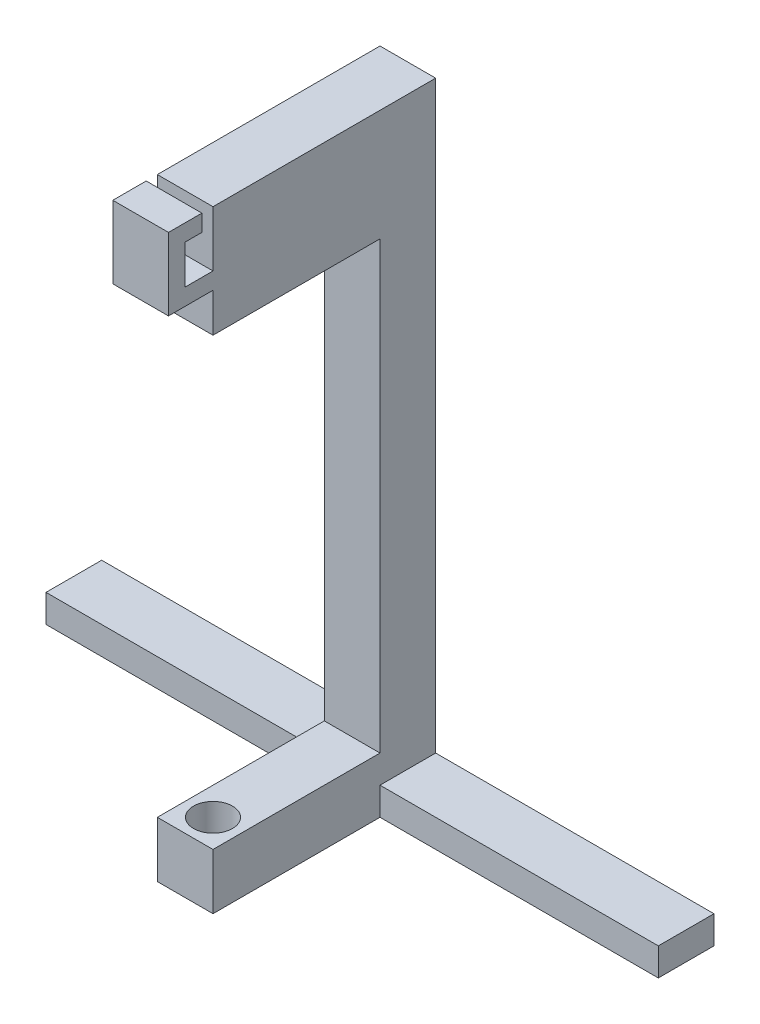
ISO-10303-21;
HEADER;
FILE_DESCRIPTION(('STEP AP214'),'2;1');
FILE_NAME('part.step','',(''),(''),'','','');
FILE_SCHEMA(('AUTOMOTIVE_DESIGN { 1 0 10303 214 1 1 1 1 }'));
ENDSEC;
DATA;
#1=APPLICATION_CONTEXT('core data for automotive mechanical design processes');
#2=APPLICATION_PROTOCOL_DEFINITION('international standard','automotive_design',2000,#1);
#3=PRODUCT_CONTEXT('',#1,'mechanical');
#4=PRODUCT('Part','Part','',(#3));
#5=PRODUCT_RELATED_PRODUCT_CATEGORY('part','',(#4));
#6=PRODUCT_DEFINITION_FORMATION('','',#4);
#7=PRODUCT_DEFINITION_CONTEXT('part definition',#1,'design');
#8=PRODUCT_DEFINITION('design','',#6,#7);
#9=PRODUCT_DEFINITION_SHAPE('','',#8);
#10=(LENGTH_UNIT() NAMED_UNIT(*) SI_UNIT(.MILLI.,.METRE.));
#11=(NAMED_UNIT(*) PLANE_ANGLE_UNIT() SI_UNIT($,.RADIAN.));
#12=(NAMED_UNIT(*) SI_UNIT($,.STERADIAN.) SOLID_ANGLE_UNIT());
#13=UNCERTAINTY_MEASURE_WITH_UNIT(LENGTH_MEASURE(1.E-05),#10,'distance_accuracy_value','');
#14=(GEOMETRIC_REPRESENTATION_CONTEXT(3) GLOBAL_UNCERTAINTY_ASSIGNED_CONTEXT((#13)) GLOBAL_UNIT_ASSIGNED_CONTEXT((#10,
#11,#12)) REPRESENTATION_CONTEXT('',''));
#15=CARTESIAN_POINT('',(0.,0.,0.));
#16=DIRECTION('',(0.,0.,1.));
#17=DIRECTION('',(1.,0.,0.));
#18=AXIS2_PLACEMENT_3D('',#15,#16,#17);
#19=CARTESIAN_POINT('',(0.,110.,15.));
#20=DIRECTION('',(0.,0.,1.));
#21=DIRECTION('',(1.,0.,0.));
#22=AXIS2_PLACEMENT_3D('',#19,#20,#21);
#23=PLANE('',#22);
#24=DIRECTION('',(-1.,0.,0.));
#25=VECTOR('',#24,1.);
#26=CARTESIAN_POINT('',(10.,107.,15.));
#27=LINE('',#26,#25);
#28=CARTESIAN_POINT('',(10.,107.,15.));
#29=VERTEX_POINT('',#28);
#30=CARTESIAN_POINT('',(0.,107.,15.));
#31=VERTEX_POINT('',#30);
#32=EDGE_CURVE('E201',#29,#31,#27,.T.);
#33=ORIENTED_EDGE('',*,*,#32,.F.);
#34=DIRECTION('',(0.,-1.,0.));
#35=VECTOR('',#34,1.);
#36=CARTESIAN_POINT('',(10.,110.,15.));
#37=LINE('',#36,#35);
#38=CARTESIAN_POINT('',(10.,100.,15.));
#39=VERTEX_POINT('',#38);
#40=EDGE_CURVE('E205',#29,#39,#37,.T.);
#41=ORIENTED_EDGE('',*,*,#40,.T.);
#42=DIRECTION('',(-1.,0.,0.));
#43=VECTOR('',#42,1.);
#44=CARTESIAN_POINT('',(0.,100.,15.));
#45=LINE('',#44,#43);
#46=CARTESIAN_POINT('',(0.,100.,15.));
#47=VERTEX_POINT('',#46);
#48=EDGE_CURVE('E206',#39,#47,#45,.T.);
#49=ORIENTED_EDGE('',*,*,#48,.T.);
#50=DIRECTION('',(0.,-1.,0.));
#51=VECTOR('',#50,1.);
#52=CARTESIAN_POINT('',(0.,110.,15.));
#53=LINE('',#52,#51);
#54=EDGE_CURVE('E220',#31,#47,#53,.T.);
#55=ORIENTED_EDGE('',*,*,#54,.F.);
#56=EDGE_LOOP('',(#33,#41,#49,#55));
#57=FACE_BOUND('',#56,.T.);
#58=ADVANCED_FACE('F33',(#57),#23,.F.);
#59=CARTESIAN_POINT('',(0.,100.,18.));
#60=DIRECTION('',(0.,-1.,0.));
#61=DIRECTION('',(0.,0.,-1.));
#62=AXIS2_PLACEMENT_3D('',#59,#60,#61);
#63=PLANE('',#62);
#64=ORIENTED_EDGE('',*,*,#48,.F.);
#65=DIRECTION('',(0.,0.,-1.));
#66=VECTOR('',#65,1.);
#67=CARTESIAN_POINT('',(10.,100.,18.));
#68=LINE('',#67,#66);
#69=CARTESIAN_POINT('',(10.,100.,10.));
#70=VERTEX_POINT('',#69);
#71=EDGE_CURVE('E48',#39,#70,#68,.T.);
#72=ORIENTED_EDGE('',*,*,#71,.T.);
#73=DIRECTION('',(-1.,0.,0.));
#74=VECTOR('',#73,1.);
#75=CARTESIAN_POINT('',(0.,100.,10.));
#76=LINE('',#75,#74);
#77=CARTESIAN_POINT('',(0.,100.,10.));
#78=VERTEX_POINT('',#77);
#79=EDGE_CURVE('E229',#70,#78,#76,.T.);
#80=ORIENTED_EDGE('',*,*,#79,.T.);
#81=DIRECTION('',(0.,0.,-1.));
#82=VECTOR('',#81,1.);
#83=CARTESIAN_POINT('',(0.,100.,18.));
#84=LINE('',#83,#82);
#85=EDGE_CURVE('E233',#47,#78,#84,.T.);
#86=ORIENTED_EDGE('',*,*,#85,.F.);
#87=EDGE_LOOP('',(#64,#72,#80,#86));
#88=FACE_BOUND('',#87,.T.);
#89=ADVANCED_FACE('F429',(#88),#63,.F.);
#90=CARTESIAN_POINT('',(0.,0.,10.));
#91=DIRECTION('',(0.,0.,1.));
#92=DIRECTION('',(1.,0.,0.));
#93=AXIS2_PLACEMENT_3D('',#90,#91,#92);
#94=PLANE('',#93);
#95=DIRECTION('',(0.,1.,0.));
#96=VECTOR('',#95,1.);
#97=CARTESIAN_POINT('',(10.,110.,10.));
#98=LINE('',#97,#96);
#99=CARTESIAN_POINT('',(10.,90.,10.));
#100=VERTEX_POINT('',#99);
#101=CARTESIAN_POINT('',(10.,97.,10.));
#102=VERTEX_POINT('',#101);
#103=EDGE_CURVE('E308',#100,#102,#98,.T.);
#104=ORIENTED_EDGE('',*,*,#103,.T.);
#105=DIRECTION('',(1.,0.,0.));
#106=VECTOR('',#105,1.);
#107=CARTESIAN_POINT('',(0.,97.,10.));
#108=LINE('',#107,#106);
#109=CARTESIAN_POINT('',(0.,97.,10.));
#110=VERTEX_POINT('',#109);
#111=EDGE_CURVE('E224',#110,#102,#108,.T.);
#112=ORIENTED_EDGE('',*,*,#111,.F.);
#113=DIRECTION('',(0.,-1.,0.));
#114=VECTOR('',#113,1.);
#115=CARTESIAN_POINT('',(0.,110.,10.));
#116=LINE('',#115,#114);
#117=CARTESIAN_POINT('',(0.,90.,10.));
#118=VERTEX_POINT('',#117);
#119=EDGE_CURVE('E303',#110,#118,#116,.T.);
#120=ORIENTED_EDGE('',*,*,#119,.T.);
#121=DIRECTION('',(-1.,0.,0.));
#122=VECTOR('',#121,1.);
#123=CARTESIAN_POINT('',(0.,90.,10.));
#124=LINE('',#123,#122);
#125=EDGE_CURVE('E300',#100,#118,#124,.T.);
#126=ORIENTED_EDGE('',*,*,#125,.F.);
#127=EDGE_LOOP('',(#104,#112,#120,#126));
#128=FACE_BOUND('',#127,.T.);
#129=ADVANCED_FACE('F412',(#128),#94,.T.);
#130=CARTESIAN_POINT('',(0.,110.,10.));
#131=VERTEX_POINT('',#130);
#132=EDGE_CURVE('E304',#131,#78,#116,.T.);
#133=ORIENTED_EDGE('',*,*,#132,.T.);
#134=ORIENTED_EDGE('',*,*,#79,.F.);
#135=CARTESIAN_POINT('',(10.,110.,10.));
#136=VERTEX_POINT('',#135);
#137=EDGE_CURVE('E307',#70,#136,#98,.T.);
#138=ORIENTED_EDGE('',*,*,#137,.T.);
#139=DIRECTION('',(-1.,0.,0.));
#140=VECTOR('',#139,1.);
#141=CARTESIAN_POINT('',(0.,110.,10.));
#142=LINE('',#141,#140);
#143=EDGE_CURVE('E311',#136,#131,#142,.T.);
#144=ORIENTED_EDGE('',*,*,#143,.T.);
#145=EDGE_LOOP('',(#133,#134,#138,#144));
#146=FACE_BOUND('',#145,.T.);
#147=ADVANCED_FACE('F433',(#146),#94,.T.);
#148=CARTESIAN_POINT('',(0.,110.,-20.));
#149=DIRECTION('',(0.,0.,-1.));
#150=DIRECTION('',(-1.,0.,0.));
#151=AXIS2_PLACEMENT_3D('',#148,#149,#150);
#152=PLANE('',#151);
#153=DIRECTION('',(-1.,0.,0.));
#154=VECTOR('',#153,1.);
#155=CARTESIAN_POINT('',(10.,90.,-20.));
#156=LINE('',#155,#154);
#157=CARTESIAN_POINT('',(10.,90.,-20.));
#158=VERTEX_POINT('',#157);
#159=CARTESIAN_POINT('',(0.,90.,-20.));
#160=VERTEX_POINT('',#159);
#161=EDGE_CURVE('E289',#158,#160,#156,.T.);
#162=ORIENTED_EDGE('',*,*,#161,.T.);
#163=DIRECTION('',(0.,-1.,0.));
#164=VECTOR('',#163,1.);
#165=CARTESIAN_POINT('',(0.,110.,-20.));
#166=LINE('',#165,#164);
#167=CARTESIAN_POINT('',(0.,10.,-20.));
#168=VERTEX_POINT('',#167);
#169=EDGE_CURVE('E327',#160,#168,#166,.T.);
#170=ORIENTED_EDGE('',*,*,#169,.T.);
#171=DIRECTION('',(1.,0.,0.));
#172=VECTOR('',#171,1.);
#173=CARTESIAN_POINT('',(0.,10.,-20.));
#174=LINE('',#173,#172);
#175=CARTESIAN_POINT('',(10.,10.,-20.));
#176=VERTEX_POINT('',#175);
#177=EDGE_CURVE('E314',#168,#176,#174,.T.);
#178=ORIENTED_EDGE('',*,*,#177,.T.);
#179=DIRECTION('',(0.,-1.,0.));
#180=VECTOR('',#179,1.);
#181=CARTESIAN_POINT('',(10.,110.,-20.));
#182=LINE('',#181,#180);
#183=EDGE_CURVE('E323',#158,#176,#182,.T.);
#184=ORIENTED_EDGE('',*,*,#183,.F.);
#185=EDGE_LOOP('',(#162,#170,#178,#184));
#186=FACE_BOUND('',#185,.T.);
#187=ADVANCED_FACE('F405',(#186),#152,.F.);
#188=CARTESIAN_POINT('',(0.,10.,10.));
#189=DIRECTION('',(0.,-1.,0.));
#190=DIRECTION('',(0.,0.,-1.));
#191=AXIS2_PLACEMENT_3D('',#188,#189,#190);
#192=PLANE('',#191);
#193=CARTESIAN_POINT('',(5.,10.,5.));
#194=DIRECTION('',(0.,1.,0.));
#195=DIRECTION('',(0.,0.,1.));
#196=AXIS2_PLACEMENT_3D('',#193,#194,#195);
#197=CIRCLE('',#196,3.5);
#198=CARTESIAN_POINT('',(5.,10.,8.5));
#199=VERTEX_POINT('',#198);
#200=EDGE_CURVE('E336',#199,#199,#197,.T.);
#201=ORIENTED_EDGE('',*,*,#200,.F.);
#202=EDGE_LOOP('',(#201));
#203=FACE_BOUND('',#202,.T.);
#204=ORIENTED_EDGE('',*,*,#177,.F.);
#205=DIRECTION('',(0.,0.,-1.));
#206=VECTOR('',#205,1.);
#207=CARTESIAN_POINT('',(0.,10.,10.));
#208=LINE('',#207,#206);
#209=CARTESIAN_POINT('',(0.,10.,10.));
#210=VERTEX_POINT('',#209);
#211=EDGE_CURVE('E351',#210,#168,#208,.T.);
#212=ORIENTED_EDGE('',*,*,#211,.F.);
#213=DIRECTION('',(-1.,0.,0.));
#214=VECTOR('',#213,1.);
#215=CARTESIAN_POINT('',(0.,10.,10.));
#216=LINE('',#215,#214);
#217=CARTESIAN_POINT('',(10.,10.,10.));
#218=VERTEX_POINT('',#217);
#219=EDGE_CURVE('E349',#218,#210,#216,.T.);
#220=ORIENTED_EDGE('',*,*,#219,.F.);
#221=DIRECTION('',(0.,0.,-1.));
#222=VECTOR('',#221,1.);
#223=CARTESIAN_POINT('',(10.,10.,10.));
#224=LINE('',#223,#222);
#225=EDGE_CURVE('E354',#218,#176,#224,.T.);
#226=ORIENTED_EDGE('',*,*,#225,.T.);
#227=EDGE_LOOP('',(#204,#212,#220,#226));
#228=FACE_BOUND('',#227,.T.);
#229=ADVANCED_FACE('F400',(#203,#228),#192,.F.);
#230=CARTESIAN_POINT('',(0.,0.,10.));
#231=DIRECTION('',(1.,0.,0.));
#232=DIRECTION('',(0.,0.,-1.));
#233=AXIS2_PLACEMENT_3D('',#230,#231,#232);
#234=PLANE('',#233);
#235=DIRECTION('',(0.,0.,1.));
#236=VECTOR('',#235,1.);
#237=CARTESIAN_POINT('',(0.,5.,10.));
#238=LINE('',#237,#236);
#239=CARTESIAN_POINT('',(0.,5.,-30.));
#240=VERTEX_POINT('',#239);
#241=CARTESIAN_POINT('',(0.,5.,-20.));
#242=VERTEX_POINT('',#241);
#243=EDGE_CURVE('E283',#240,#242,#238,.T.);
#244=ORIENTED_EDGE('',*,*,#243,.T.);
#245=DIRECTION('',(0.,-1.,0.));
#246=VECTOR('',#245,1.);
#247=CARTESIAN_POINT('',(0.,0.,-20.));
#248=LINE('',#247,#246);
#249=CARTESIAN_POINT('',(0.,0.,-20.));
#250=VERTEX_POINT('',#249);
#251=EDGE_CURVE('E286',#242,#250,#248,.T.);
#252=ORIENTED_EDGE('',*,*,#251,.T.);
#253=DIRECTION('',(0.,0.,-1.));
#254=VECTOR('',#253,1.);
#255=CARTESIAN_POINT('',(0.,0.,10.));
#256=LINE('',#255,#254);
#257=CARTESIAN_POINT('',(0.,0.,10.));
#258=VERTEX_POINT('',#257);
#259=EDGE_CURVE('E41',#258,#250,#256,.T.);
#260=ORIENTED_EDGE('',*,*,#259,.F.);
#261=DIRECTION('',(0.,-1.,0.));
#262=VECTOR('',#261,1.);
#263=CARTESIAN_POINT('',(0.,0.,10.));
#264=LINE('',#263,#262);
#265=EDGE_CURVE('E340',#210,#258,#264,.T.);
#266=ORIENTED_EDGE('',*,*,#265,.F.);
#267=ORIENTED_EDGE('',*,*,#211,.T.);
#268=ORIENTED_EDGE('',*,*,#169,.F.);
#269=DIRECTION('',(0.,0.,-1.));
#270=VECTOR('',#269,1.);
#271=CARTESIAN_POINT('',(0.,90.,10.));
#272=LINE('',#271,#270);
#273=EDGE_CURVE('E295',#118,#160,#272,.T.);
#274=ORIENTED_EDGE('',*,*,#273,.F.);
#275=ORIENTED_EDGE('',*,*,#119,.F.);
#276=DIRECTION('',(0.,0.,-1.));
#277=VECTOR('',#276,1.);
#278=CARTESIAN_POINT('',(0.,97.,18.));
#279=LINE('',#278,#277);
#280=CARTESIAN_POINT('',(0.,97.,18.));
#281=VERTEX_POINT('',#280);
#282=EDGE_CURVE('E241',#281,#110,#279,.T.);
#283=ORIENTED_EDGE('',*,*,#282,.F.);
#284=DIRECTION('',(0.,-1.,0.));
#285=VECTOR('',#284,1.);
#286=CARTESIAN_POINT('',(0.,100.,18.));
#287=LINE('',#286,#285);
#288=CARTESIAN_POINT('',(0.,110.,18.));
#289=VERTEX_POINT('',#288);
#290=EDGE_CURVE('E225',#289,#281,#287,.T.);
#291=ORIENTED_EDGE('',*,*,#290,.F.);
#292=DIRECTION('',(0.,0.,1.));
#293=VECTOR('',#292,1.);
#294=CARTESIAN_POINT('',(0.,110.,18.));
#295=LINE('',#294,#293);
#296=CARTESIAN_POINT('',(0.,110.,12.));
#297=VERTEX_POINT('',#296);
#298=EDGE_CURVE('E209',#297,#289,#295,.T.);
#299=ORIENTED_EDGE('',*,*,#298,.F.);
#300=DIRECTION('',(0.,1.,0.));
#301=VECTOR('',#300,1.);
#302=CARTESIAN_POINT('',(0.,110.,12.));
#303=LINE('',#302,#301);
#304=CARTESIAN_POINT('',(0.,107.,12.));
#305=VERTEX_POINT('',#304);
#306=EDGE_CURVE('E192',#305,#297,#303,.T.);
#307=ORIENTED_EDGE('',*,*,#306,.F.);
#308=DIRECTION('',(0.,0.,1.));
#309=VECTOR('',#308,1.);
#310=CARTESIAN_POINT('',(0.,107.,12.));
#311=LINE('',#310,#309);
#312=EDGE_CURVE('E188',#305,#31,#311,.T.);
#313=ORIENTED_EDGE('',*,*,#312,.T.);
#314=ORIENTED_EDGE('',*,*,#54,.T.);
#315=ORIENTED_EDGE('',*,*,#85,.T.);
#316=ORIENTED_EDGE('',*,*,#132,.F.);
#317=DIRECTION('',(0.,0.,1.));
#318=VECTOR('',#317,1.);
#319=CARTESIAN_POINT('',(0.,110.,-30.));
#320=LINE('',#319,#318);
#321=CARTESIAN_POINT('',(0.,110.,-30.));
#322=VERTEX_POINT('',#321);
#323=EDGE_CURVE('E315',#322,#131,#320,.T.);
#324=ORIENTED_EDGE('',*,*,#323,.F.);
#325=DIRECTION('',(0.,1.,0.));
#326=VECTOR('',#325,1.);
#327=CARTESIAN_POINT('',(0.,10.,-30.));
#328=LINE('',#327,#326);
#329=EDGE_CURVE('E334',#240,#322,#328,.T.);
#330=ORIENTED_EDGE('',*,*,#329,.F.);
#331=EDGE_LOOP('',(#244,#252,#260,#266,#267,#268,#274,#275,#283,#291,#299,#307,#313,#314,#315,
#316,#324,#330));
#332=FACE_BOUND('',#331,.T.);
#333=ADVANCED_FACE('F35',(#332),#234,.F.);
#334=CARTESIAN_POINT('',(0.,0.,10.));
#335=DIRECTION('',(0.,1.,0.));
#336=DIRECTION('',(0.,0.,1.));
#337=AXIS2_PLACEMENT_3D('',#334,#335,#336);
#338=PLANE('',#337);
#339=ORIENTED_EDGE('',*,*,#259,.T.);
#340=DIRECTION('',(1.,0.,0.));
#341=VECTOR('',#340,1.);
#342=CARTESIAN_POINT('',(-50.,0.,-20.));
#343=LINE('',#342,#341);
#344=CARTESIAN_POINT('',(-50.,0.,-20.));
#345=VERTEX_POINT('',#344);
#346=EDGE_CURVE('E280',#345,#250,#343,.T.);
#347=ORIENTED_EDGE('',*,*,#346,.F.);
#348=DIRECTION('',(0.,0.,-1.));
#349=VECTOR('',#348,1.);
#350=CARTESIAN_POINT('',(-50.,0.,-20.));
#351=LINE('',#350,#349);
#352=CARTESIAN_POINT('',(-50.,0.,-30.));
#353=VERTEX_POINT('',#352);
#354=EDGE_CURVE('E261',#345,#353,#351,.T.);
#355=ORIENTED_EDGE('',*,*,#354,.T.);
#356=DIRECTION('',(-1.,0.,0.));
#357=VECTOR('',#356,1.);
#358=CARTESIAN_POINT('',(10.,0.,-30.));
#359=LINE('',#358,#357);
#360=CARTESIAN_POINT('',(60.,0.,-30.));
#361=VERTEX_POINT('',#360);
#362=EDGE_CURVE('E332',#361,#353,#359,.T.);
#363=ORIENTED_EDGE('',*,*,#362,.F.);
#364=DIRECTION('',(0.,0.,-1.));
#365=VECTOR('',#364,1.);
#366=CARTESIAN_POINT('',(60.,0.,-20.));
#367=LINE('',#366,#365);
#368=CARTESIAN_POINT('',(60.,0.,-20.));
#369=VERTEX_POINT('',#368);
#370=EDGE_CURVE('E249',#369,#361,#367,.T.);
#371=ORIENTED_EDGE('',*,*,#370,.F.);
#372=CARTESIAN_POINT('',(10.,0.,-20.));
#373=VERTEX_POINT('',#372);
#374=EDGE_CURVE('E270',#373,#369,#343,.T.);
#375=ORIENTED_EDGE('',*,*,#374,.F.);
#376=DIRECTION('',(0.,0.,-1.));
#377=VECTOR('',#376,1.);
#378=CARTESIAN_POINT('',(10.,0.,10.));
#379=LINE('',#378,#377);
#380=CARTESIAN_POINT('',(10.,0.,10.));
#381=VERTEX_POINT('',#380);
#382=EDGE_CURVE('E357',#381,#373,#379,.T.);
#383=ORIENTED_EDGE('',*,*,#382,.F.);
#384=DIRECTION('',(1.,0.,0.));
#385=VECTOR('',#384,1.);
#386=CARTESIAN_POINT('',(0.,0.,10.));
#387=LINE('',#386,#385);
#388=EDGE_CURVE('E345',#258,#381,#387,.T.);
#389=ORIENTED_EDGE('',*,*,#388,.F.);
#390=EDGE_LOOP('',(#339,#347,#355,#363,#371,#375,#383,#389));
#391=FACE_BOUND('',#390,.T.);
#392=ADVANCED_FACE('F361',(#391),#338,.F.);
#393=CARTESIAN_POINT('',(10.,0.,10.));
#394=DIRECTION('',(-1.,0.,0.));
#395=DIRECTION('',(0.,0.,1.));
#396=AXIS2_PLACEMENT_3D('',#393,#394,#395);
#397=PLANE('',#396);
#398=ORIENTED_EDGE('',*,*,#382,.T.);
#399=DIRECTION('',(0.,1.,0.));
#400=VECTOR('',#399,1.);
#401=CARTESIAN_POINT('',(10.,0.,-20.));
#402=LINE('',#401,#400);
#403=CARTESIAN_POINT('',(10.,5.,-20.));
#404=VERTEX_POINT('',#403);
#405=EDGE_CURVE('E11',#373,#404,#402,.T.);
#406=ORIENTED_EDGE('',*,*,#405,.T.);
#407=DIRECTION('',(0.,0.,-1.));
#408=VECTOR('',#407,1.);
#409=CARTESIAN_POINT('',(10.,5.,10.));
#410=LINE('',#409,#408);
#411=CARTESIAN_POINT('',(10.,5.,-30.));
#412=VERTEX_POINT('',#411);
#413=EDGE_CURVE('E274',#404,#412,#410,.T.);
#414=ORIENTED_EDGE('',*,*,#413,.T.);
#415=DIRECTION('',(0.,-1.,0.));
#416=VECTOR('',#415,1.);
#417=CARTESIAN_POINT('',(10.,10.,-30.));
#418=LINE('',#417,#416);
#419=CARTESIAN_POINT('',(10.,110.,-30.));
#420=VERTEX_POINT('',#419);
#421=EDGE_CURVE('E329',#420,#412,#418,.T.);
#422=ORIENTED_EDGE('',*,*,#421,.F.);
#423=DIRECTION('',(0.,0.,-1.));
#424=VECTOR('',#423,1.);
#425=CARTESIAN_POINT('',(10.,110.,-30.));
#426=LINE('',#425,#424);
#427=EDGE_CURVE('E317',#136,#420,#426,.T.);
#428=ORIENTED_EDGE('',*,*,#427,.F.);
#429=ORIENTED_EDGE('',*,*,#137,.F.);
#430=ORIENTED_EDGE('',*,*,#71,.F.);
#431=ORIENTED_EDGE('',*,*,#40,.F.);
#432=DIRECTION('',(0.,0.,1.));
#433=VECTOR('',#432,1.);
#434=CARTESIAN_POINT('',(10.,107.,12.));
#435=LINE('',#434,#433);
#436=CARTESIAN_POINT('',(10.,107.,12.));
#437=VERTEX_POINT('',#436);
#438=EDGE_CURVE('E185',#437,#29,#435,.T.);
#439=ORIENTED_EDGE('',*,*,#438,.F.);
#440=DIRECTION('',(0.,-1.,0.));
#441=VECTOR('',#440,1.);
#442=CARTESIAN_POINT('',(10.,110.,12.));
#443=LINE('',#442,#441);
#444=CARTESIAN_POINT('',(10.,110.,12.));
#445=VERTEX_POINT('',#444);
#446=EDGE_CURVE('E193',#445,#437,#443,.T.);
#447=ORIENTED_EDGE('',*,*,#446,.F.);
#448=DIRECTION('',(0.,0.,-1.));
#449=VECTOR('',#448,1.);
#450=CARTESIAN_POINT('',(10.,110.,18.));
#451=LINE('',#450,#449);
#452=CARTESIAN_POINT('',(10.,110.,18.));
#453=VERTEX_POINT('',#452);
#454=EDGE_CURVE('E219',#453,#445,#451,.T.);
#455=ORIENTED_EDGE('',*,*,#454,.F.);
#456=DIRECTION('',(0.,1.,0.));
#457=VECTOR('',#456,1.);
#458=CARTESIAN_POINT('',(10.,100.,18.));
#459=LINE('',#458,#457);
#460=CARTESIAN_POINT('',(10.,97.,18.));
#461=VERTEX_POINT('',#460);
#462=EDGE_CURVE('E231',#461,#453,#459,.T.);
#463=ORIENTED_EDGE('',*,*,#462,.F.);
#464=DIRECTION('',(0.,0.,-1.));
#465=VECTOR('',#464,1.);
#466=CARTESIAN_POINT('',(10.,97.,18.));
#467=LINE('',#466,#465);
#468=EDGE_CURVE('E238',#461,#102,#467,.T.);
#469=ORIENTED_EDGE('',*,*,#468,.T.);
#470=ORIENTED_EDGE('',*,*,#103,.F.);
#471=DIRECTION('',(0.,0.,1.));
#472=VECTOR('',#471,1.);
#473=CARTESIAN_POINT('',(10.,90.,10.));
#474=LINE('',#473,#472);
#475=EDGE_CURVE('E297',#158,#100,#474,.T.);
#476=ORIENTED_EDGE('',*,*,#475,.F.);
#477=ORIENTED_EDGE('',*,*,#183,.T.);
#478=ORIENTED_EDGE('',*,*,#225,.F.);
#479=DIRECTION('',(0.,1.,0.));
#480=VECTOR('',#479,1.);
#481=CARTESIAN_POINT('',(10.,0.,10.));
#482=LINE('',#481,#480);
#483=EDGE_CURVE('E347',#381,#218,#482,.T.);
#484=ORIENTED_EDGE('',*,*,#483,.F.);
#485=EDGE_LOOP('',(#398,#406,#414,#422,#428,#429,#430,#431,#439,#447,#455,#463,#469,#470,#476,
#477,#478,#484));
#486=FACE_BOUND('',#485,.T.);
#487=ADVANCED_FACE('F204',(#486),#397,.F.);
#488=CARTESIAN_POINT('',(0.,0.,10.));
#489=DIRECTION('',(0.,0.,-1.));
#490=DIRECTION('',(-1.,0.,0.));
#491=AXIS2_PLACEMENT_3D('',#488,#489,#490);
#492=PLANE('',#491);
#493=ORIENTED_EDGE('',*,*,#265,.T.);
#494=ORIENTED_EDGE('',*,*,#388,.T.);
#495=ORIENTED_EDGE('',*,*,#483,.T.);
#496=ORIENTED_EDGE('',*,*,#219,.T.);
#497=EDGE_LOOP('',(#493,#494,#495,#496));
#498=FACE_BOUND('',#497,.T.);
#499=ADVANCED_FACE('F396',(#498),#492,.F.);
#500=CARTESIAN_POINT('',(5.,5.,5.));
#501=DIRECTION('',(0.,1.,0.));
#502=DIRECTION('',(0.,0.,1.));
#503=AXIS2_PLACEMENT_3D('',#500,#501,#502);
#504=CYLINDRICAL_SURFACE('',#503,3.5);
#505=CARTESIAN_POINT('',(5.,5.,5.));
#506=DIRECTION('',(0.,1.,0.));
#507=DIRECTION('',(0.,0.,1.));
#508=AXIS2_PLACEMENT_3D('',#505,#506,#507);
#509=CIRCLE('',#508,3.5);
#510=CARTESIAN_POINT('',(5.,5.,8.5));
#511=VERTEX_POINT('',#510);
#512=EDGE_CURVE('E337',#511,#511,#509,.T.);
#513=ORIENTED_EDGE('',*,*,#512,.F.);
#514=EDGE_LOOP('',(#513));
#515=FACE_BOUND('',#514,.T.);
#516=ORIENTED_EDGE('',*,*,#200,.T.);
#517=EDGE_LOOP('',(#516));
#518=FACE_BOUND('',#517,.T.);
#519=ADVANCED_FACE('F494',(#515,#518),#504,.F.);
#520=CARTESIAN_POINT('',(5.,5.,5.));
#521=DIRECTION('',(0.,1.,0.));
#522=DIRECTION('',(0.,0.,1.));
#523=AXIS2_PLACEMENT_3D('',#520,#521,#522);
#524=PLANE('',#523);
#525=ORIENTED_EDGE('',*,*,#512,.T.);
#526=EDGE_LOOP('',(#525));
#527=FACE_BOUND('',#526,.T.);
#528=ADVANCED_FACE('F448',(#527),#524,.T.);
#529=CARTESIAN_POINT('',(0.,0.,-30.));
#530=DIRECTION('',(0.,0.,-1.));
#531=DIRECTION('',(-1.,0.,0.));
#532=AXIS2_PLACEMENT_3D('',#529,#530,#531);
#533=PLANE('',#532);
#534=ORIENTED_EDGE('',*,*,#421,.T.);
#535=DIRECTION('',(1.,0.,0.));
#536=VECTOR('',#535,1.);
#537=CARTESIAN_POINT('',(-50.,5.,-30.));
#538=LINE('',#537,#536);
#539=CARTESIAN_POINT('',(60.,5.,-30.));
#540=VERTEX_POINT('',#539);
#541=EDGE_CURVE('E279',#412,#540,#538,.T.);
#542=ORIENTED_EDGE('',*,*,#541,.T.);
#543=DIRECTION('',(0.,1.,0.));
#544=VECTOR('',#543,1.);
#545=CARTESIAN_POINT('',(60.,0.,-30.));
#546=LINE('',#545,#544);
#547=EDGE_CURVE('E252',#361,#540,#546,.T.);
#548=ORIENTED_EDGE('',*,*,#547,.F.);
#549=ORIENTED_EDGE('',*,*,#362,.T.);
#550=DIRECTION('',(0.,1.,0.));
#551=VECTOR('',#550,1.);
#552=CARTESIAN_POINT('',(-50.,0.,-30.));
#553=LINE('',#552,#551);
#554=CARTESIAN_POINT('',(-50.,5.,-30.));
#555=VERTEX_POINT('',#554);
#556=EDGE_CURVE('E264',#353,#555,#553,.T.);
#557=ORIENTED_EDGE('',*,*,#556,.T.);
#558=EDGE_CURVE('E276',#555,#240,#538,.T.);
#559=ORIENTED_EDGE('',*,*,#558,.T.);
#560=ORIENTED_EDGE('',*,*,#329,.T.);
#561=DIRECTION('',(-1.,0.,0.));
#562=VECTOR('',#561,1.);
#563=CARTESIAN_POINT('',(0.,110.,-30.));
#564=LINE('',#563,#562);
#565=EDGE_CURVE('E320',#420,#322,#564,.T.);
#566=ORIENTED_EDGE('',*,*,#565,.F.);
#567=EDGE_LOOP('',(#534,#542,#548,#549,#557,#559,#560,#566));
#568=FACE_BOUND('',#567,.T.);
#569=ADVANCED_FACE('F384',(#568),#533,.T.);
#570=CARTESIAN_POINT('',(0.,110.,0.));
#571=DIRECTION('',(0.,1.,0.));
#572=DIRECTION('',(0.,0.,1.));
#573=AXIS2_PLACEMENT_3D('',#570,#571,#572);
#574=PLANE('',#573);
#575=ORIENTED_EDGE('',*,*,#323,.T.);
#576=ORIENTED_EDGE('',*,*,#143,.F.);
#577=ORIENTED_EDGE('',*,*,#427,.T.);
#578=ORIENTED_EDGE('',*,*,#565,.T.);
#579=EDGE_LOOP('',(#575,#576,#577,#578));
#580=FACE_BOUND('',#579,.T.);
#581=ADVANCED_FACE('F438',(#580),#574,.T.);
#582=CARTESIAN_POINT('',(0.,90.,0.));
#583=DIRECTION('',(0.,-1.,0.));
#584=DIRECTION('',(0.,0.,-1.));
#585=AXIS2_PLACEMENT_3D('',#582,#583,#584);
#586=PLANE('',#585);
#587=CARTESIAN_POINT('',(4.79794449651649,90.,5.));
#588=DIRECTION('',(0.,-1.,0.));
#589=DIRECTION('',(0.,0.,-1.));
#590=AXIS2_PLACEMENT_3D('',#587,#588,#589);
#591=CIRCLE('',#590,3.5);
#592=CARTESIAN_POINT('',(4.79794449651649,90.,1.5));
#593=VERTEX_POINT('',#592);
#594=EDGE_CURVE('E292',#593,#593,#591,.T.);
#595=ORIENTED_EDGE('',*,*,#594,.F.);
#596=EDGE_LOOP('',(#595));
#597=FACE_BOUND('',#596,.T.);
#598=ORIENTED_EDGE('',*,*,#273,.T.);
#599=ORIENTED_EDGE('',*,*,#161,.F.);
#600=ORIENTED_EDGE('',*,*,#475,.T.);
#601=ORIENTED_EDGE('',*,*,#125,.T.);
#602=EDGE_LOOP('',(#598,#599,#600,#601));
#603=FACE_BOUND('',#602,.T.);
#604=ADVANCED_FACE('F409',(#597,#603),#586,.T.);
#605=CARTESIAN_POINT('',(4.79794449651649,100.,5.));
#606=DIRECTION('',(0.,-1.,0.));
#607=DIRECTION('',(0.,0.,-1.));
#608=AXIS2_PLACEMENT_3D('',#605,#606,#607);
#609=CYLINDRICAL_SURFACE('',#608,3.5);
#610=ORIENTED_EDGE('',*,*,#594,.T.);
#611=EDGE_LOOP('',(#610));
#612=FACE_BOUND('',#611,.T.);
#613=CARTESIAN_POINT('',(4.79794449651649,105.,5.));
#614=DIRECTION('',(0.,-1.,0.));
#615=DIRECTION('',(0.,0.,-1.));
#616=AXIS2_PLACEMENT_3D('',#613,#614,#615);
#617=CIRCLE('',#616,3.5);
#618=CARTESIAN_POINT('',(4.79794449651649,105.,1.5));
#619=VERTEX_POINT('',#618);
#620=EDGE_CURVE('E243',#619,#619,#617,.T.);
#621=ORIENTED_EDGE('',*,*,#620,.F.);
#622=EDGE_LOOP('',(#621));
#623=FACE_BOUND('',#622,.T.);
#624=ADVANCED_FACE('F445',(#612,#623),#609,.F.);
#625=CARTESIAN_POINT('',(60.,0.,0.));
#626=DIRECTION('',(-1.,0.,0.));
#627=DIRECTION('',(0.,0.,1.));
#628=AXIS2_PLACEMENT_3D('',#625,#626,#627);
#629=PLANE('',#628);
#630=DIRECTION('',(0.,-1.,0.));
#631=VECTOR('',#630,1.);
#632=CARTESIAN_POINT('',(60.,0.,-20.));
#633=LINE('',#632,#631);
#634=CARTESIAN_POINT('',(60.,5.,-20.));
#635=VERTEX_POINT('',#634);
#636=EDGE_CURVE('E246',#635,#369,#633,.T.);
#637=ORIENTED_EDGE('',*,*,#636,.T.);
#638=ORIENTED_EDGE('',*,*,#370,.T.);
#639=ORIENTED_EDGE('',*,*,#547,.T.);
#640=DIRECTION('',(0.,0.,1.));
#641=VECTOR('',#640,1.);
#642=CARTESIAN_POINT('',(60.,5.,-20.));
#643=LINE('',#642,#641);
#644=EDGE_CURVE('E255',#540,#635,#643,.T.);
#645=ORIENTED_EDGE('',*,*,#644,.T.);
#646=EDGE_LOOP('',(#637,#638,#639,#645));
#647=FACE_BOUND('',#646,.T.);
#648=ADVANCED_FACE('F381',(#647),#629,.F.);
#649=CARTESIAN_POINT('',(-50.,5.,-20.));
#650=DIRECTION('',(0.,1.,0.));
#651=DIRECTION('',(0.,0.,1.));
#652=AXIS2_PLACEMENT_3D('',#649,#650,#651);
#653=PLANE('',#652);
#654=ORIENTED_EDGE('',*,*,#413,.F.);
#655=DIRECTION('',(1.,0.,0.));
#656=VECTOR('',#655,1.);
#657=CARTESIAN_POINT('',(-50.,5.,-20.));
#658=LINE('',#657,#656);
#659=EDGE_CURVE('E275',#404,#635,#658,.T.);
#660=ORIENTED_EDGE('',*,*,#659,.T.);
#661=ORIENTED_EDGE('',*,*,#644,.F.);
#662=ORIENTED_EDGE('',*,*,#541,.F.);
#663=EDGE_LOOP('',(#654,#660,#661,#662));
#664=FACE_BOUND('',#663,.T.);
#665=ADVANCED_FACE('F388',(#664),#653,.T.);
#666=CARTESIAN_POINT('',(-50.,0.,-20.));
#667=DIRECTION('',(0.,0.,1.));
#668=DIRECTION('',(1.,0.,0.));
#669=AXIS2_PLACEMENT_3D('',#666,#667,#668);
#670=PLANE('',#669);
#671=ORIENTED_EDGE('',*,*,#405,.F.);
#672=ORIENTED_EDGE('',*,*,#374,.T.);
#673=ORIENTED_EDGE('',*,*,#636,.F.);
#674=ORIENTED_EDGE('',*,*,#659,.F.);
#675=EDGE_LOOP('',(#671,#672,#673,#674));
#676=FACE_BOUND('',#675,.T.);
#677=ADVANCED_FACE('F391',(#676),#670,.T.);
#678=ORIENTED_EDGE('',*,*,#251,.F.);
#679=CARTESIAN_POINT('',(-50.,5.,-20.));
#680=VERTEX_POINT('',#679);
#681=EDGE_CURVE('E271',#680,#242,#658,.T.);
#682=ORIENTED_EDGE('',*,*,#681,.F.);
#683=DIRECTION('',(0.,-1.,0.));
#684=VECTOR('',#683,1.);
#685=CARTESIAN_POINT('',(-50.,0.,-20.));
#686=LINE('',#685,#684);
#687=EDGE_CURVE('E258',#680,#345,#686,.T.);
#688=ORIENTED_EDGE('',*,*,#687,.T.);
#689=ORIENTED_EDGE('',*,*,#346,.T.);
#690=EDGE_LOOP('',(#678,#682,#688,#689));
#691=FACE_BOUND('',#690,.T.);
#692=ADVANCED_FACE('F368',(#691),#670,.T.);
#693=ORIENTED_EDGE('',*,*,#243,.F.);
#694=ORIENTED_EDGE('',*,*,#558,.F.);
#695=DIRECTION('',(0.,0.,1.));
#696=VECTOR('',#695,1.);
#697=CARTESIAN_POINT('',(-50.,5.,-20.));
#698=LINE('',#697,#696);
#699=EDGE_CURVE('E267',#555,#680,#698,.T.);
#700=ORIENTED_EDGE('',*,*,#699,.T.);
#701=ORIENTED_EDGE('',*,*,#681,.T.);
#702=EDGE_LOOP('',(#693,#694,#700,#701));
#703=FACE_BOUND('',#702,.T.);
#704=ADVANCED_FACE('F371',(#703),#653,.T.);
#705=CARTESIAN_POINT('',(-50.,0.,0.));
#706=DIRECTION('',(-1.,0.,0.));
#707=DIRECTION('',(0.,0.,1.));
#708=AXIS2_PLACEMENT_3D('',#705,#706,#707);
#709=PLANE('',#708);
#710=ORIENTED_EDGE('',*,*,#687,.F.);
#711=ORIENTED_EDGE('',*,*,#699,.F.);
#712=ORIENTED_EDGE('',*,*,#556,.F.);
#713=ORIENTED_EDGE('',*,*,#354,.F.);
#714=EDGE_LOOP('',(#710,#711,#712,#713));
#715=FACE_BOUND('',#714,.T.);
#716=ADVANCED_FACE('F375',(#715),#709,.T.);
#717=CARTESIAN_POINT('',(4.79794449651649,105.,5.));
#718=DIRECTION('',(0.,-1.,0.));
#719=DIRECTION('',(0.,0.,-1.));
#720=AXIS2_PLACEMENT_3D('',#717,#718,#719);
#721=PLANE('',#720);
#722=ORIENTED_EDGE('',*,*,#620,.T.);
#723=EDGE_LOOP('',(#722));
#724=FACE_BOUND('',#723,.T.);
#725=ADVANCED_FACE('F465',(#724),#721,.T.);
#726=CARTESIAN_POINT('',(0.,97.,18.));
#727=DIRECTION('',(0.,1.,0.));
#728=DIRECTION('',(0.,0.,1.));
#729=AXIS2_PLACEMENT_3D('',#726,#727,#728);
#730=PLANE('',#729);
#731=ORIENTED_EDGE('',*,*,#111,.T.);
#732=ORIENTED_EDGE('',*,*,#468,.F.);
#733=DIRECTION('',(1.,0.,0.));
#734=VECTOR('',#733,1.);
#735=CARTESIAN_POINT('',(0.,97.,18.));
#736=LINE('',#735,#734);
#737=EDGE_CURVE('E228',#281,#461,#736,.T.);
#738=ORIENTED_EDGE('',*,*,#737,.F.);
#739=ORIENTED_EDGE('',*,*,#282,.T.);
#740=EDGE_LOOP('',(#731,#732,#738,#739));
#741=FACE_BOUND('',#740,.T.);
#742=ADVANCED_FACE('F417',(#741),#730,.F.);
#743=CARTESIAN_POINT('',(0.,0.,18.));
#744=DIRECTION('',(0.,0.,1.));
#745=DIRECTION('',(1.,0.,0.));
#746=AXIS2_PLACEMENT_3D('',#743,#744,#745);
#747=PLANE('',#746);
#748=ORIENTED_EDGE('',*,*,#290,.T.);
#749=ORIENTED_EDGE('',*,*,#737,.T.);
#750=ORIENTED_EDGE('',*,*,#462,.T.);
#751=DIRECTION('',(1.,0.,0.));
#752=VECTOR('',#751,1.);
#753=CARTESIAN_POINT('',(0.,110.,18.));
#754=LINE('',#753,#752);
#755=EDGE_CURVE('E216',#289,#453,#754,.T.);
#756=ORIENTED_EDGE('',*,*,#755,.F.);
#757=EDGE_LOOP('',(#748,#749,#750,#756));
#758=FACE_BOUND('',#757,.T.);
#759=ADVANCED_FACE('F421',(#758),#747,.T.);
#760=CARTESIAN_POINT('',(0.,110.,0.));
#761=DIRECTION('',(0.,-1.,0.));
#762=DIRECTION('',(0.,0.,-1.));
#763=AXIS2_PLACEMENT_3D('',#760,#761,#762);
#764=PLANE('',#763);
#765=ORIENTED_EDGE('',*,*,#298,.T.);
#766=ORIENTED_EDGE('',*,*,#755,.T.);
#767=ORIENTED_EDGE('',*,*,#454,.T.);
#768=DIRECTION('',(1.,0.,0.));
#769=VECTOR('',#768,1.);
#770=CARTESIAN_POINT('',(10.,110.,12.));
#771=LINE('',#770,#769);
#772=EDGE_CURVE('E199',#297,#445,#771,.T.);
#773=ORIENTED_EDGE('',*,*,#772,.F.);
#774=EDGE_LOOP('',(#765,#766,#767,#773));
#775=FACE_BOUND('',#774,.T.);
#776=ADVANCED_FACE('F423',(#775),#764,.F.);
#777=CARTESIAN_POINT('',(10.,107.,12.));
#778=DIRECTION('',(0.,1.,0.));
#779=DIRECTION('',(0.,0.,1.));
#780=AXIS2_PLACEMENT_3D('',#777,#778,#779);
#781=PLANE('',#780);
#782=ORIENTED_EDGE('',*,*,#32,.T.);
#783=ORIENTED_EDGE('',*,*,#312,.F.);
#784=DIRECTION('',(-1.,0.,0.));
#785=VECTOR('',#784,1.);
#786=CARTESIAN_POINT('',(10.,107.,12.));
#787=LINE('',#786,#785);
#788=EDGE_CURVE('E181',#437,#305,#787,.T.);
#789=ORIENTED_EDGE('',*,*,#788,.F.);
#790=ORIENTED_EDGE('',*,*,#438,.T.);
#791=EDGE_LOOP('',(#782,#783,#789,#790));
#792=FACE_BOUND('',#791,.T.);
#793=ADVANCED_FACE('F183',(#792),#781,.F.);
#794=CARTESIAN_POINT('',(0.,0.,12.));
#795=DIRECTION('',(0.,0.,-1.));
#796=DIRECTION('',(-1.,0.,0.));
#797=AXIS2_PLACEMENT_3D('',#794,#795,#796);
#798=PLANE('',#797);
#799=ORIENTED_EDGE('',*,*,#446,.T.);
#800=ORIENTED_EDGE('',*,*,#788,.T.);
#801=ORIENTED_EDGE('',*,*,#306,.T.);
#802=ORIENTED_EDGE('',*,*,#772,.T.);
#803=EDGE_LOOP('',(#799,#800,#801,#802));
#804=FACE_BOUND('',#803,.T.);
#805=ADVANCED_FACE('F197',(#804),#798,.T.);
#806=CLOSED_SHELL('',(#58,#89,#129,#147,#187,#229,#333,#392,#487,#499,#519,#528,#569,#581,#604,
#624,#648,#665,#677,#692,#704,#716,#725,#742,#759,#776,#793,#805));
#807=MANIFOLD_SOLID_BREP('B2',#806);
#808=ADVANCED_BREP_SHAPE_REPRESENTATION('',(#18,#807),#14);
#809=SHAPE_DEFINITION_REPRESENTATION(#9,#808);
ENDSEC;
END-ISO-10303-21;
